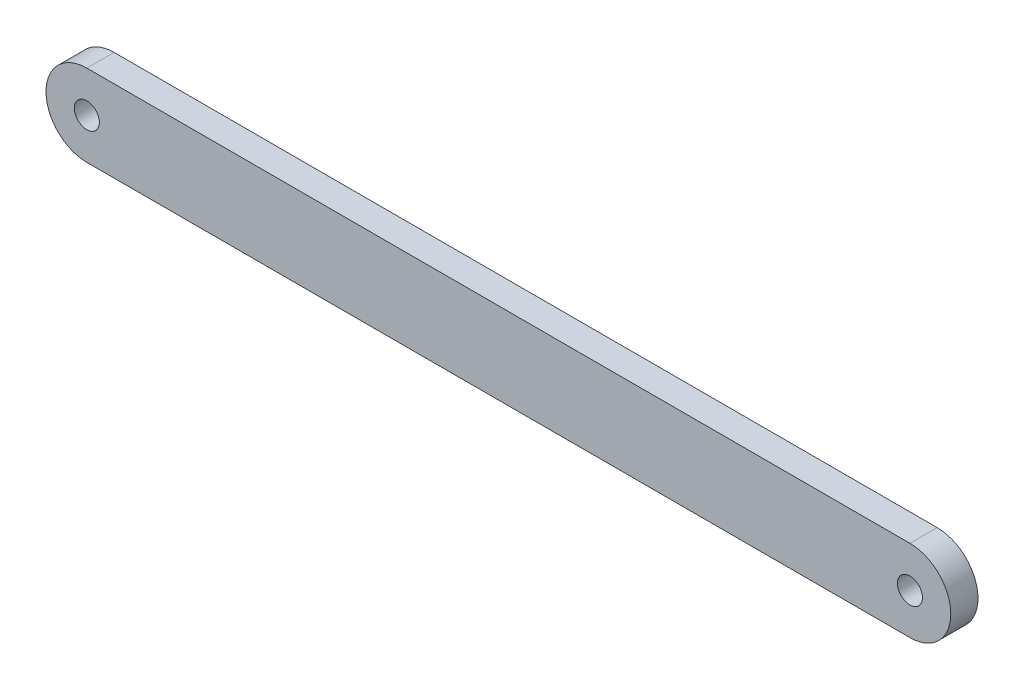
ISO-10303-21;
HEADER;
FILE_DESCRIPTION(('STEP AP214'),'2;1');
FILE_NAME('part.step','',(''),(''),'','','');
FILE_SCHEMA(('AUTOMOTIVE_DESIGN { 1 0 10303 214 1 1 1 1 }'));
ENDSEC;
DATA;
#1=APPLICATION_CONTEXT('core data for automotive mechanical design processes');
#2=APPLICATION_PROTOCOL_DEFINITION('international standard','automotive_design',2000,#1);
#3=PRODUCT_CONTEXT('',#1,'mechanical');
#4=PRODUCT('Part','Part','',(#3));
#5=PRODUCT_RELATED_PRODUCT_CATEGORY('part','',(#4));
#6=PRODUCT_DEFINITION_FORMATION('','',#4);
#7=PRODUCT_DEFINITION_CONTEXT('part definition',#1,'design');
#8=PRODUCT_DEFINITION('design','',#6,#7);
#9=PRODUCT_DEFINITION_SHAPE('','',#8);
#10=(LENGTH_UNIT() NAMED_UNIT(*) SI_UNIT(.MILLI.,.METRE.));
#11=(NAMED_UNIT(*) PLANE_ANGLE_UNIT() SI_UNIT($,.RADIAN.));
#12=(NAMED_UNIT(*) SI_UNIT($,.STERADIAN.) SOLID_ANGLE_UNIT());
#13=UNCERTAINTY_MEASURE_WITH_UNIT(LENGTH_MEASURE(1.E-05),#10,'distance_accuracy_value','');
#14=(GEOMETRIC_REPRESENTATION_CONTEXT(3) GLOBAL_UNCERTAINTY_ASSIGNED_CONTEXT((#13)) GLOBAL_UNIT_ASSIGNED_CONTEXT((#10,
#11,#12)) REPRESENTATION_CONTEXT('',''));
#15=CARTESIAN_POINT('',(0.,0.,0.));
#16=DIRECTION('',(0.,0.,1.));
#17=DIRECTION('',(1.,0.,0.));
#18=AXIS2_PLACEMENT_3D('',#15,#16,#17);
#19=CARTESIAN_POINT('',(75.6,0.,5.));
#20=DIRECTION('',(0.,0.,-1.));
#21=DIRECTION('',(-1.,0.,0.));
#22=AXIS2_PLACEMENT_3D('',#19,#20,#21);
#23=PLANE('',#22);
#24=CARTESIAN_POINT('',(75.6,0.,5.));
#25=DIRECTION('',(0.,0.,1.));
#26=DIRECTION('',(-1.,0.,0.));
#27=AXIS2_PLACEMENT_3D('',#24,#25,#26);
#28=CIRCLE('',#27,7.5);
#29=CARTESIAN_POINT('',(75.6,-7.5,5.));
#30=VERTEX_POINT('',#29);
#31=CARTESIAN_POINT('',(75.6,7.5,5.));
#32=VERTEX_POINT('',#31);
#33=EDGE_CURVE('E87',#30,#32,#28,.T.);
#34=ORIENTED_EDGE('',*,*,#33,.T.);
#35=DIRECTION('',(-1.,0.,0.));
#36=VECTOR('',#35,1.);
#37=CARTESIAN_POINT('',(-75.6,7.5,5.));
#38=LINE('',#37,#36);
#39=CARTESIAN_POINT('',(-75.6,7.5,5.));
#40=VERTEX_POINT('',#39);
#41=EDGE_CURVE('E82',#32,#40,#38,.T.);
#42=ORIENTED_EDGE('',*,*,#41,.T.);
#43=CARTESIAN_POINT('',(-75.6,0.,5.));
#44=DIRECTION('',(0.,0.,1.));
#45=DIRECTION('',(1.,0.,0.));
#46=AXIS2_PLACEMENT_3D('',#43,#44,#45);
#47=CIRCLE('',#46,7.5);
#48=CARTESIAN_POINT('',(-75.6,-7.5,5.));
#49=VERTEX_POINT('',#48);
#50=EDGE_CURVE('E85',#40,#49,#47,.T.);
#51=ORIENTED_EDGE('',*,*,#50,.T.);
#52=DIRECTION('',(1.,0.,0.));
#53=VECTOR('',#52,1.);
#54=CARTESIAN_POINT('',(-75.6,-7.5,5.));
#55=LINE('',#54,#53);
#56=EDGE_CURVE('E52',#49,#30,#55,.T.);
#57=ORIENTED_EDGE('',*,*,#56,.T.);
#58=EDGE_LOOP('',(#34,#42,#51,#57));
#59=FACE_BOUND('',#58,.T.);
#60=CARTESIAN_POINT('',(-75.6,0.,5.));
#61=DIRECTION('',(0.,0.,1.));
#62=DIRECTION('',(1.,0.,0.));
#63=AXIS2_PLACEMENT_3D('',#60,#61,#62);
#64=CIRCLE('',#63,2.30000000000001);
#65=CARTESIAN_POINT('',(-73.3,0.,5.));
#66=VERTEX_POINT('',#65);
#67=EDGE_CURVE('E102',#66,#66,#64,.T.);
#68=ORIENTED_EDGE('',*,*,#67,.F.);
#69=EDGE_LOOP('',(#68));
#70=FACE_BOUND('',#69,.T.);
#71=CARTESIAN_POINT('',(75.6,0.,5.));
#72=DIRECTION('',(0.,0.,1.));
#73=DIRECTION('',(1.,0.,0.));
#74=AXIS2_PLACEMENT_3D('',#71,#72,#73);
#75=CIRCLE('',#74,2.30000000000001);
#76=CARTESIAN_POINT('',(77.9,0.,5.));
#77=VERTEX_POINT('',#76);
#78=EDGE_CURVE('E117',#77,#77,#75,.T.);
#79=ORIENTED_EDGE('',*,*,#78,.F.);
#80=EDGE_LOOP('',(#79));
#81=FACE_BOUND('',#80,.T.);
#82=ADVANCED_FACE('F35',(#59,#70,#81),#23,.F.);
#83=CARTESIAN_POINT('',(75.6,0.,0.));
#84=DIRECTION('',(0.,0.,-1.));
#85=DIRECTION('',(-1.,0.,0.));
#86=AXIS2_PLACEMENT_3D('',#83,#84,#85);
#87=PLANE('',#86);
#88=CARTESIAN_POINT('',(-75.6,0.,0.));
#89=DIRECTION('',(0.,0.,1.));
#90=DIRECTION('',(1.,0.,0.));
#91=AXIS2_PLACEMENT_3D('',#88,#89,#90);
#92=CIRCLE('',#91,2.30000000000001);
#93=CARTESIAN_POINT('',(-73.3,0.,0.));
#94=VERTEX_POINT('',#93);
#95=EDGE_CURVE('E114',#94,#94,#92,.T.);
#96=ORIENTED_EDGE('',*,*,#95,.T.);
#97=EDGE_LOOP('',(#96));
#98=FACE_BOUND('',#97,.T.);
#99=CARTESIAN_POINT('',(75.6,0.,0.));
#100=DIRECTION('',(0.,0.,1.));
#101=DIRECTION('',(-1.,0.,0.));
#102=AXIS2_PLACEMENT_3D('',#99,#100,#101);
#103=CIRCLE('',#102,7.5);
#104=CARTESIAN_POINT('',(75.6,-7.5,0.));
#105=VERTEX_POINT('',#104);
#106=CARTESIAN_POINT('',(75.6,7.5,0.));
#107=VERTEX_POINT('',#106);
#108=EDGE_CURVE('E99',#105,#107,#103,.T.);
#109=ORIENTED_EDGE('',*,*,#108,.F.);
#110=DIRECTION('',(1.,0.,0.));
#111=VECTOR('',#110,1.);
#112=CARTESIAN_POINT('',(-75.6,-7.5,0.));
#113=LINE('',#112,#111);
#114=CARTESIAN_POINT('',(-75.6,-7.5,0.));
#115=VERTEX_POINT('',#114);
#116=EDGE_CURVE('E75',#115,#105,#113,.T.);
#117=ORIENTED_EDGE('',*,*,#116,.F.);
#118=CARTESIAN_POINT('',(-75.6,0.,0.));
#119=DIRECTION('',(0.,0.,1.));
#120=DIRECTION('',(1.,0.,0.));
#121=AXIS2_PLACEMENT_3D('',#118,#119,#120);
#122=CIRCLE('',#121,7.5);
#123=CARTESIAN_POINT('',(-75.6,7.5,0.));
#124=VERTEX_POINT('',#123);
#125=EDGE_CURVE('E69',#124,#115,#122,.T.);
#126=ORIENTED_EDGE('',*,*,#125,.F.);
#127=DIRECTION('',(-1.,0.,0.));
#128=VECTOR('',#127,1.);
#129=CARTESIAN_POINT('',(-75.6,7.5,0.));
#130=LINE('',#129,#128);
#131=EDGE_CURVE('E91',#107,#124,#130,.T.);
#132=ORIENTED_EDGE('',*,*,#131,.F.);
#133=EDGE_LOOP('',(#109,#117,#126,#132));
#134=FACE_BOUND('',#133,.T.);
#135=CARTESIAN_POINT('',(75.6,0.,0.));
#136=DIRECTION('',(0.,0.,1.));
#137=DIRECTION('',(1.,0.,0.));
#138=AXIS2_PLACEMENT_3D('',#135,#136,#137);
#139=CIRCLE('',#138,2.30000000000001);
#140=CARTESIAN_POINT('',(77.9,0.,0.));
#141=VERTEX_POINT('',#140);
#142=EDGE_CURVE('E120',#141,#141,#139,.T.);
#143=ORIENTED_EDGE('',*,*,#142,.T.);
#144=EDGE_LOOP('',(#143));
#145=FACE_BOUND('',#144,.T.);
#146=ADVANCED_FACE('F110',(#98,#134,#145),#87,.T.);
#147=CARTESIAN_POINT('',(75.6,0.,5.));
#148=DIRECTION('',(0.,0.,-1.));
#149=DIRECTION('',(-1.,0.,0.));
#150=AXIS2_PLACEMENT_3D('',#147,#148,#149);
#151=CYLINDRICAL_SURFACE('',#150,7.5);
#152=ORIENTED_EDGE('',*,*,#108,.T.);
#153=DIRECTION('',(0.,0.,-1.));
#154=VECTOR('',#153,1.);
#155=CARTESIAN_POINT('',(75.6,7.5,5.));
#156=LINE('',#155,#154);
#157=EDGE_CURVE('E11',#32,#107,#156,.T.);
#158=ORIENTED_EDGE('',*,*,#157,.F.);
#159=ORIENTED_EDGE('',*,*,#33,.F.);
#160=DIRECTION('',(0.,0.,-1.));
#161=VECTOR('',#160,1.);
#162=CARTESIAN_POINT('',(75.6,-7.5,5.));
#163=LINE('',#162,#161);
#164=EDGE_CURVE('E95',#30,#105,#163,.T.);
#165=ORIENTED_EDGE('',*,*,#164,.T.);
#166=EDGE_LOOP('',(#152,#158,#159,#165));
#167=FACE_BOUND('',#166,.T.);
#168=ADVANCED_FACE('F37',(#167),#151,.T.);
#169=CARTESIAN_POINT('',(-75.6,7.5,5.));
#170=DIRECTION('',(0.,-1.,0.));
#171=DIRECTION('',(0.,0.,-1.));
#172=AXIS2_PLACEMENT_3D('',#169,#170,#171);
#173=PLANE('',#172);
#174=ORIENTED_EDGE('',*,*,#131,.T.);
#175=DIRECTION('',(0.,0.,-1.));
#176=VECTOR('',#175,1.);
#177=CARTESIAN_POINT('',(-75.6,7.5,5.));
#178=LINE('',#177,#176);
#179=EDGE_CURVE('E44',#40,#124,#178,.T.);
#180=ORIENTED_EDGE('',*,*,#179,.F.);
#181=ORIENTED_EDGE('',*,*,#41,.F.);
#182=ORIENTED_EDGE('',*,*,#157,.T.);
#183=EDGE_LOOP('',(#174,#180,#181,#182));
#184=FACE_BOUND('',#183,.T.);
#185=ADVANCED_FACE('F90',(#184),#173,.F.);
#186=CARTESIAN_POINT('',(-75.6,0.,5.));
#187=DIRECTION('',(0.,0.,-1.));
#188=DIRECTION('',(-1.,0.,0.));
#189=AXIS2_PLACEMENT_3D('',#186,#187,#188);
#190=CYLINDRICAL_SURFACE('',#189,7.5);
#191=ORIENTED_EDGE('',*,*,#125,.T.);
#192=DIRECTION('',(0.,0.,-1.));
#193=VECTOR('',#192,1.);
#194=CARTESIAN_POINT('',(-75.6,-7.5,5.));
#195=LINE('',#194,#193);
#196=EDGE_CURVE('E92',#49,#115,#195,.T.);
#197=ORIENTED_EDGE('',*,*,#196,.F.);
#198=ORIENTED_EDGE('',*,*,#50,.F.);
#199=ORIENTED_EDGE('',*,*,#179,.T.);
#200=EDGE_LOOP('',(#191,#197,#198,#199));
#201=FACE_BOUND('',#200,.T.);
#202=ADVANCED_FACE('F93',(#201),#190,.T.);
#203=CARTESIAN_POINT('',(-75.6,-7.5,5.));
#204=DIRECTION('',(0.,1.,0.));
#205=DIRECTION('',(0.,0.,1.));
#206=AXIS2_PLACEMENT_3D('',#203,#204,#205);
#207=PLANE('',#206);
#208=ORIENTED_EDGE('',*,*,#116,.T.);
#209=ORIENTED_EDGE('',*,*,#164,.F.);
#210=ORIENTED_EDGE('',*,*,#56,.F.);
#211=ORIENTED_EDGE('',*,*,#196,.T.);
#212=EDGE_LOOP('',(#208,#209,#210,#211));
#213=FACE_BOUND('',#212,.T.);
#214=ADVANCED_FACE('F107',(#213),#207,.F.);
#215=CARTESIAN_POINT('',(-75.6,0.,5.));
#216=DIRECTION('',(0.,0.,-1.));
#217=DIRECTION('',(-1.,0.,0.));
#218=AXIS2_PLACEMENT_3D('',#215,#216,#217);
#219=CYLINDRICAL_SURFACE('',#218,2.30000000000001);
#220=ORIENTED_EDGE('',*,*,#67,.T.);
#221=EDGE_LOOP('',(#220));
#222=FACE_BOUND('',#221,.T.);
#223=ORIENTED_EDGE('',*,*,#95,.F.);
#224=EDGE_LOOP('',(#223));
#225=FACE_BOUND('',#224,.T.);
#226=ADVANCED_FACE('F137',(#222,#225),#219,.F.);
#227=CARTESIAN_POINT('',(75.6,0.,5.));
#228=DIRECTION('',(0.,0.,-1.));
#229=DIRECTION('',(-1.,0.,0.));
#230=AXIS2_PLACEMENT_3D('',#227,#228,#229);
#231=CYLINDRICAL_SURFACE('',#230,2.30000000000001);
#232=ORIENTED_EDGE('',*,*,#78,.T.);
#233=EDGE_LOOP('',(#232));
#234=FACE_BOUND('',#233,.T.);
#235=ORIENTED_EDGE('',*,*,#142,.F.);
#236=EDGE_LOOP('',(#235));
#237=FACE_BOUND('',#236,.T.);
#238=ADVANCED_FACE('F126',(#234,#237),#231,.F.);
#239=CLOSED_SHELL('',(#82,#146,#168,#185,#202,#214,#226,#238));
#240=MANIFOLD_SOLID_BREP('B2',#239);
#241=ADVANCED_BREP_SHAPE_REPRESENTATION('',(#18,#240),#14);
#242=SHAPE_DEFINITION_REPRESENTATION(#9,#241);
ENDSEC;
END-ISO-10303-21;
